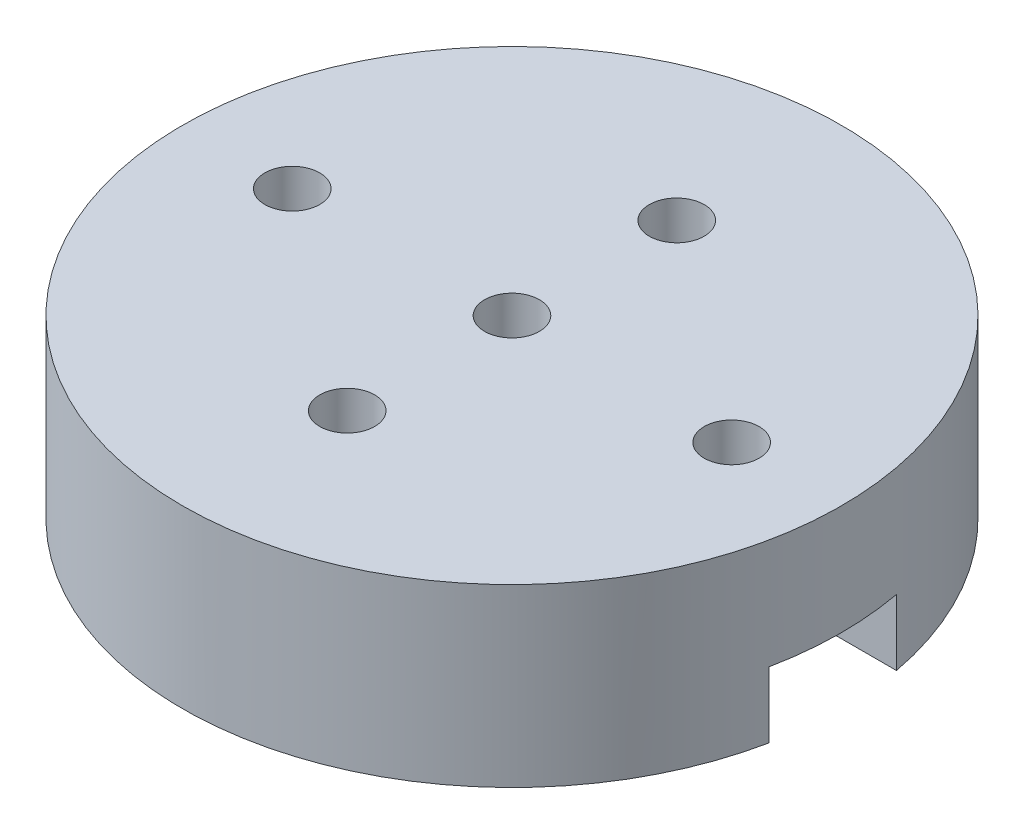
ISO-10303-21;
HEADER;
FILE_DESCRIPTION(('STEP AP214'),'2;1');
FILE_NAME('part.step','',(''),(''),'','','');
FILE_SCHEMA(('AUTOMOTIVE_DESIGN { 1 0 10303 214 1 1 1 1 }'));
ENDSEC;
DATA;
#1=APPLICATION_CONTEXT('core data for automotive mechanical design processes');
#2=APPLICATION_PROTOCOL_DEFINITION('international standard','automotive_design',2000,#1);
#3=PRODUCT_CONTEXT('',#1,'mechanical');
#4=PRODUCT('Part','Part','',(#3));
#5=PRODUCT_RELATED_PRODUCT_CATEGORY('part','',(#4));
#6=PRODUCT_DEFINITION_FORMATION('','',#4);
#7=PRODUCT_DEFINITION_CONTEXT('part definition',#1,'design');
#8=PRODUCT_DEFINITION('design','',#6,#7);
#9=PRODUCT_DEFINITION_SHAPE('','',#8);
#10=(LENGTH_UNIT() NAMED_UNIT(*) SI_UNIT(.MILLI.,.METRE.));
#11=(NAMED_UNIT(*) PLANE_ANGLE_UNIT() SI_UNIT($,.RADIAN.));
#12=(NAMED_UNIT(*) SI_UNIT($,.STERADIAN.) SOLID_ANGLE_UNIT());
#13=UNCERTAINTY_MEASURE_WITH_UNIT(LENGTH_MEASURE(1.E-05),#10,'distance_accuracy_value','');
#14=(GEOMETRIC_REPRESENTATION_CONTEXT(3) GLOBAL_UNCERTAINTY_ASSIGNED_CONTEXT((#13)) GLOBAL_UNIT_ASSIGNED_CONTEXT((#10,
#11,#12)) REPRESENTATION_CONTEXT('',''));
#15=CARTESIAN_POINT('',(0.,0.,0.));
#16=DIRECTION('',(0.,0.,1.));
#17=DIRECTION('',(1.,0.,0.));
#18=AXIS2_PLACEMENT_3D('',#15,#16,#17);
#19=CARTESIAN_POINT('',(0.,0.,0.));
#20=DIRECTION('',(0.,1.,0.));
#21=DIRECTION('',(0.,0.,1.));
#22=AXIS2_PLACEMENT_3D('',#19,#20,#21);
#23=PLANE('',#22);
#24=CARTESIAN_POINT('',(23.4547924708941,0.,-40.6248922405439));
#25=DIRECTION('',(0.,1.,0.));
#26=DIRECTION('',(0.,0.,1.));
#27=AXIS2_PLACEMENT_3D('',#24,#25,#26);
#28=CIRCLE('',#27,3.00000000000001);
#29=CARTESIAN_POINT('',(21.9547924708933,0.,-38.026816029191));
#30=VERTEX_POINT('',#29);
#31=CARTESIAN_POINT('',(24.9547924708948,0.,-43.2229684518967));
#32=VERTEX_POINT('',#31);
#33=EDGE_CURVE('E350',#30,#32,#28,.T.);
#34=ORIENTED_EDGE('',*,*,#33,.T.);
#35=CARTESIAN_POINT('',(0.,0.,2.91433543964104E-13));
#36=DIRECTION('',(0.,1.,0.));
#37=DIRECTION('',(0.,0.,1.));
#38=AXIS2_PLACEMENT_3D('',#35,#36,#37);
#39=CIRCLE('',#38,49.9095849417636);
#40=CARTESIAN_POINT('',(-24.9547924708814,0.,-43.2229684519044));
#41=VERTEX_POINT('',#40);
#42=EDGE_CURVE('E374',#32,#41,#39,.T.);
#43=ORIENTED_EDGE('',*,*,#42,.T.);
#44=CARTESIAN_POINT('',(-23.4547924708814,0.,-40.6248922405511));
#45=DIRECTION('',(0.,1.,0.));
#46=DIRECTION('',(0.,0.,1.));
#47=AXIS2_PLACEMENT_3D('',#44,#45,#46);
#48=CIRCLE('',#47,3.);
#49=CARTESIAN_POINT('',(-21.9547924708814,0.,-38.0268160291978));
#50=VERTEX_POINT('',#49);
#51=EDGE_CURVE('E378',#41,#50,#48,.T.);
#52=ORIENTED_EDGE('',*,*,#51,.T.);
#53=CARTESIAN_POINT('',(0.,0.,2.91433543964104E-13));
#54=DIRECTION('',(0.,1.,0.));
#55=DIRECTION('',(0.,0.,1.));
#56=AXIS2_PLACEMENT_3D('',#53,#54,#55);
#57=CIRCLE('',#56,43.9095849417636);
#58=EDGE_CURVE('E363',#30,#50,#57,.T.);
#59=ORIENTED_EDGE('',*,*,#58,.F.);
#60=EDGE_LOOP('',(#34,#43,#52,#59));
#61=FACE_BOUND('',#60,.T.);
#62=DIRECTION('',(0.,0.,1.));
#63=VECTOR('',#62,1.);
#64=CARTESIAN_POINT('',(-12.,0.,0.));
#65=LINE('',#64,#63);
#66=CARTESIAN_POINT('',(-12.,0.,-25.));
#67=VERTEX_POINT('',#66);
#68=CARTESIAN_POINT('',(-12.,0.,-11.0283902133288));
#69=VERTEX_POINT('',#68);
#70=EDGE_CURVE('E267',#67,#69,#65,.T.);
#71=ORIENTED_EDGE('',*,*,#70,.T.);
#72=DIRECTION('',(-1.,0.,0.));
#73=VECTOR('',#72,1.);
#74=CARTESIAN_POINT('',(0.,0.,-11.0283902133288));
#75=LINE('',#74,#73);
#76=CARTESIAN_POINT('',(-58.9777467296145,0.,-11.0283902133288));
#77=VERTEX_POINT('',#76);
#78=EDGE_CURVE('E274',#69,#77,#75,.T.);
#79=ORIENTED_EDGE('',*,*,#78,.T.);
#80=CARTESIAN_POINT('',(0.,0.,0.));
#81=DIRECTION('',(0.,1.,0.));
#82=DIRECTION('',(0.,0.,1.));
#83=AXIS2_PLACEMENT_3D('',#80,#81,#82);
#84=CIRCLE('',#83,60.);
#85=CARTESIAN_POINT('',(58.9777467296145,0.,-11.0283902133288));
#86=VERTEX_POINT('',#85);
#87=EDGE_CURVE('E60',#86,#77,#84,.T.);
#88=ORIENTED_EDGE('',*,*,#87,.F.);
#89=DIRECTION('',(-1.,0.,0.));
#90=VECTOR('',#89,1.);
#91=CARTESIAN_POINT('',(0.,0.,-11.0283902133288));
#92=LINE('',#91,#90);
#93=CARTESIAN_POINT('',(12.,0.,-11.0283902133288));
#94=VERTEX_POINT('',#93);
#95=EDGE_CURVE('E259',#86,#94,#92,.T.);
#96=ORIENTED_EDGE('',*,*,#95,.T.);
#97=DIRECTION('',(0.,0.,1.));
#98=VECTOR('',#97,1.);
#99=CARTESIAN_POINT('',(12.,0.,0.));
#100=LINE('',#99,#98);
#101=CARTESIAN_POINT('',(12.,0.,-25.));
#102=VERTEX_POINT('',#101);
#103=EDGE_CURVE('E265',#102,#94,#100,.T.);
#104=ORIENTED_EDGE('',*,*,#103,.F.);
#105=CARTESIAN_POINT('',(0.,0.,-25.));
#106=DIRECTION('',(0.,1.,0.));
#107=DIRECTION('',(0.,0.,1.));
#108=AXIS2_PLACEMENT_3D('',#105,#106,#107);
#109=CIRCLE('',#108,12.);
#110=EDGE_CURVE('E269',#102,#67,#109,.T.);
#111=ORIENTED_EDGE('',*,*,#110,.T.);
#112=EDGE_LOOP('',(#71,#79,#88,#96,#104,#111));
#113=FACE_BOUND('',#112,.T.);
#114=ADVANCED_FACE('F50',(#61,#113),#23,.F.);
#115=CARTESIAN_POINT('',(0.,0.,2.91433543964104E-13));
#116=DIRECTION('',(0.,-1.,0.));
#117=DIRECTION('',(0.,0.,-1.));
#118=AXIS2_PLACEMENT_3D('',#115,#116,#117);
#119=CIRCLE('',#118,49.9095849417631);
#120=CARTESIAN_POINT('',(24.9547924708948,0.,43.2229684518967));
#121=VERTEX_POINT('',#120);
#122=CARTESIAN_POINT('',(-24.9547924708814,0.,43.2229684519044));
#123=VERTEX_POINT('',#122);
#124=EDGE_CURVE('E335',#121,#123,#119,.T.);
#125=ORIENTED_EDGE('',*,*,#124,.F.);
#126=CARTESIAN_POINT('',(23.4547924708941,0.,40.6248922405439));
#127=DIRECTION('',(0.,-1.,0.));
#128=DIRECTION('',(0.,0.,-1.));
#129=AXIS2_PLACEMENT_3D('',#126,#127,#128);
#130=CIRCLE('',#129,3.00000000000001);
#131=CARTESIAN_POINT('',(21.9547924708933,0.,38.026816029191));
#132=VERTEX_POINT('',#131);
#133=EDGE_CURVE('E71',#132,#121,#130,.T.);
#134=ORIENTED_EDGE('',*,*,#133,.F.);
#135=CARTESIAN_POINT('',(0.,0.,2.91433543964104E-13));
#136=DIRECTION('',(0.,-1.,0.));
#137=DIRECTION('',(0.,0.,-1.));
#138=AXIS2_PLACEMENT_3D('',#135,#136,#137);
#139=CIRCLE('',#138,43.9095849417631);
#140=CARTESIAN_POINT('',(-21.9547924708814,0.,38.0268160291978));
#141=VERTEX_POINT('',#140);
#142=EDGE_CURVE('E316',#132,#141,#139,.T.);
#143=ORIENTED_EDGE('',*,*,#142,.T.);
#144=CARTESIAN_POINT('',(-23.4547924708814,0.,40.6248922405511));
#145=DIRECTION('',(0.,-1.,0.));
#146=DIRECTION('',(0.,0.,-1.));
#147=AXIS2_PLACEMENT_3D('',#144,#145,#146);
#148=CIRCLE('',#147,3.);
#149=EDGE_CURVE('E340',#123,#141,#148,.T.);
#150=ORIENTED_EDGE('',*,*,#149,.F.);
#151=EDGE_LOOP('',(#125,#134,#143,#150));
#152=FACE_BOUND('',#151,.T.);
#153=CARTESIAN_POINT('',(-58.7877538267963,0.,12.));
#154=VERTEX_POINT('',#153);
#155=CARTESIAN_POINT('',(58.7877538267949,0.,12.));
#156=VERTEX_POINT('',#155);
#157=EDGE_CURVE('E51',#154,#156,#84,.T.);
#158=ORIENTED_EDGE('',*,*,#157,.F.);
#159=DIRECTION('',(1.,0.,0.));
#160=VECTOR('',#159,1.);
#161=CARTESIAN_POINT('',(0.,0.,12.));
#162=LINE('',#161,#160);
#163=CARTESIAN_POINT('',(-12.0000000000002,0.,12.));
#164=VERTEX_POINT('',#163);
#165=EDGE_CURVE('E213',#154,#164,#162,.T.);
#166=ORIENTED_EDGE('',*,*,#165,.T.);
#167=DIRECTION('',(0.,0.,-1.));
#168=VECTOR('',#167,1.);
#169=CARTESIAN_POINT('',(-12.0000000000004,0.,2.09768100325818E-13));
#170=LINE('',#169,#168);
#171=CARTESIAN_POINT('',(-12.,0.,25.));
#172=VERTEX_POINT('',#171);
#173=EDGE_CURVE('E212',#172,#164,#170,.T.);
#174=ORIENTED_EDGE('',*,*,#173,.F.);
#175=CARTESIAN_POINT('',(0.,0.,25.));
#176=DIRECTION('',(0.,1.,0.));
#177=DIRECTION('',(0.,0.,1.));
#178=AXIS2_PLACEMENT_3D('',#175,#176,#177);
#179=CIRCLE('',#178,12.);
#180=CARTESIAN_POINT('',(12.,0.,25.));
#181=VERTEX_POINT('',#180);
#182=EDGE_CURVE('E61',#181,#172,#179,.F.);
#183=ORIENTED_EDGE('',*,*,#182,.F.);
#184=DIRECTION('',(0.,0.,-1.));
#185=VECTOR('',#184,1.);
#186=CARTESIAN_POINT('',(12.0000000000004,0.,2.09768100325818E-13));
#187=LINE('',#186,#185);
#188=CARTESIAN_POINT('',(12.0000000000002,0.,12.));
#189=VERTEX_POINT('',#188);
#190=EDGE_CURVE('E192',#181,#189,#187,.T.);
#191=ORIENTED_EDGE('',*,*,#190,.T.);
#192=DIRECTION('',(1.,0.,0.));
#193=VECTOR('',#192,1.);
#194=CARTESIAN_POINT('',(0.,0.,12.));
#195=LINE('',#194,#193);
#196=EDGE_CURVE('E251',#189,#156,#195,.T.);
#197=ORIENTED_EDGE('',*,*,#196,.T.);
#198=EDGE_LOOP('',(#158,#166,#174,#183,#191,#197));
#199=FACE_BOUND('',#198,.T.);
#200=ADVANCED_FACE('F424',(#152,#199),#23,.F.);
#201=CARTESIAN_POINT('',(0.,32.,0.));
#202=DIRECTION('',(0.,-1.,0.));
#203=DIRECTION('',(0.,0.,-1.));
#204=AXIS2_PLACEMENT_3D('',#201,#202,#203);
#205=CYLINDRICAL_SURFACE('',#204,60.);
#206=CARTESIAN_POINT('',(0.,12.,0.));
#207=DIRECTION('',(0.,1.,0.));
#208=DIRECTION('',(0.,0.,1.));
#209=AXIS2_PLACEMENT_3D('',#206,#207,#208);
#210=CIRCLE('',#209,60.);
#211=CARTESIAN_POINT('',(58.7877538267949,12.,12.));
#212=VERTEX_POINT('',#211);
#213=CARTESIAN_POINT('',(58.9777467296145,12.,-11.0283902133288));
#214=VERTEX_POINT('',#213);
#215=EDGE_CURVE('E225',#212,#214,#210,.T.);
#216=ORIENTED_EDGE('',*,*,#215,.T.);
#217=DIRECTION('',(0.,-1.,0.));
#218=VECTOR('',#217,1.);
#219=CARTESIAN_POINT('',(58.9777467296145,12.,-11.0283902133288));
#220=LINE('',#219,#218);
#221=EDGE_CURVE('E304',#214,#86,#220,.T.);
#222=ORIENTED_EDGE('',*,*,#221,.T.);
#223=ORIENTED_EDGE('',*,*,#87,.T.);
#224=DIRECTION('',(0.,-1.,0.));
#225=VECTOR('',#224,1.);
#226=CARTESIAN_POINT('',(-58.9777467296145,12.,-11.0283902133288));
#227=LINE('',#226,#225);
#228=CARTESIAN_POINT('',(-58.9777467296145,12.,-11.0283902133288));
#229=VERTEX_POINT('',#228);
#230=EDGE_CURVE('E287',#229,#77,#227,.T.);
#231=ORIENTED_EDGE('',*,*,#230,.F.);
#232=CARTESIAN_POINT('',(-58.7877538267963,12.,12.));
#233=VERTEX_POINT('',#232);
#234=EDGE_CURVE('E226',#229,#233,#210,.T.);
#235=ORIENTED_EDGE('',*,*,#234,.T.);
#236=DIRECTION('',(0.,-1.,0.));
#237=VECTOR('',#236,1.);
#238=CARTESIAN_POINT('',(-58.7877538267963,12.,12.));
#239=LINE('',#238,#237);
#240=EDGE_CURVE('E289',#233,#154,#239,.T.);
#241=ORIENTED_EDGE('',*,*,#240,.T.);
#242=ORIENTED_EDGE('',*,*,#157,.T.);
#243=DIRECTION('',(0.,-1.,0.));
#244=VECTOR('',#243,1.);
#245=CARTESIAN_POINT('',(58.7877538267949,12.,12.));
#246=LINE('',#245,#244);
#247=EDGE_CURVE('E307',#212,#156,#246,.T.);
#248=ORIENTED_EDGE('',*,*,#247,.F.);
#249=EDGE_LOOP('',(#216,#222,#223,#231,#235,#241,#242,#248));
#250=FACE_BOUND('',#249,.T.);
#251=CARTESIAN_POINT('',(0.,32.,0.));
#252=DIRECTION('',(0.,1.,0.));
#253=DIRECTION('',(0.,0.,1.));
#254=AXIS2_PLACEMENT_3D('',#251,#252,#253);
#255=CIRCLE('',#254,60.);
#256=CARTESIAN_POINT('',(0.,32.,60.));
#257=VERTEX_POINT('',#256);
#258=EDGE_CURVE('E11',#257,#257,#255,.T.);
#259=ORIENTED_EDGE('',*,*,#258,.F.);
#260=EDGE_LOOP('',(#259));
#261=FACE_BOUND('',#260,.T.);
#262=ADVANCED_FACE('F47',(#250,#261),#205,.T.);
#263=CARTESIAN_POINT('',(0.,32.,0.));
#264=DIRECTION('',(0.,1.,0.));
#265=DIRECTION('',(0.,0.,1.));
#266=AXIS2_PLACEMENT_3D('',#263,#264,#265);
#267=PLANE('',#266);
#268=CARTESIAN_POINT('',(0.,32.,-30.));
#269=DIRECTION('',(0.,1.,0.));
#270=DIRECTION('',(0.,0.,1.));
#271=AXIS2_PLACEMENT_3D('',#268,#269,#270);
#272=CIRCLE('',#271,5.);
#273=CARTESIAN_POINT('',(0.,32.,-25.));
#274=VERTEX_POINT('',#273);
#275=EDGE_CURVE('E721',#274,#274,#272,.F.);
#276=ORIENTED_EDGE('',*,*,#275,.T.);
#277=EDGE_LOOP('',(#276));
#278=FACE_BOUND('',#277,.T.);
#279=CARTESIAN_POINT('',(40.,32.,0.));
#280=DIRECTION('',(0.,1.,0.));
#281=DIRECTION('',(0.,0.,1.));
#282=AXIS2_PLACEMENT_3D('',#279,#280,#281);
#283=CIRCLE('',#282,5.);
#284=CARTESIAN_POINT('',(40.,32.,5.));
#285=VERTEX_POINT('',#284);
#286=EDGE_CURVE('E733',#285,#285,#283,.F.);
#287=ORIENTED_EDGE('',*,*,#286,.T.);
#288=EDGE_LOOP('',(#287));
#289=FACE_BOUND('',#288,.T.);
#290=CARTESIAN_POINT('',(0.,32.,0.));
#291=DIRECTION('',(0.,1.,0.));
#292=DIRECTION('',(0.,0.,1.));
#293=AXIS2_PLACEMENT_3D('',#290,#291,#292);
#294=CIRCLE('',#293,5.);
#295=CARTESIAN_POINT('',(0.,32.,5.));
#296=VERTEX_POINT('',#295);
#297=EDGE_CURVE('E745',#296,#296,#294,.F.);
#298=ORIENTED_EDGE('',*,*,#297,.T.);
#299=EDGE_LOOP('',(#298));
#300=FACE_BOUND('',#299,.T.);
#301=CARTESIAN_POINT('',(-40.,32.,0.));
#302=DIRECTION('',(0.,1.,0.));
#303=DIRECTION('',(0.,0.,1.));
#304=AXIS2_PLACEMENT_3D('',#301,#302,#303);
#305=CIRCLE('',#304,5.);
#306=CARTESIAN_POINT('',(-40.,32.,5.));
#307=VERTEX_POINT('',#306);
#308=EDGE_CURVE('E753',#307,#307,#305,.F.);
#309=ORIENTED_EDGE('',*,*,#308,.T.);
#310=EDGE_LOOP('',(#309));
#311=FACE_BOUND('',#310,.T.);
#312=CARTESIAN_POINT('',(0.,32.,30.));
#313=DIRECTION('',(0.,1.,0.));
#314=DIRECTION('',(0.,0.,1.));
#315=AXIS2_PLACEMENT_3D('',#312,#313,#314);
#316=CIRCLE('',#315,5.);
#317=CARTESIAN_POINT('',(0.,32.,35.));
#318=VERTEX_POINT('',#317);
#319=EDGE_CURVE('E219',#318,#318,#316,.F.);
#320=ORIENTED_EDGE('',*,*,#319,.T.);
#321=EDGE_LOOP('',(#320));
#322=FACE_BOUND('',#321,.T.);
#323=ORIENTED_EDGE('',*,*,#258,.T.);
#324=EDGE_LOOP('',(#323));
#325=FACE_BOUND('',#324,.T.);
#326=ADVANCED_FACE('F464',(#278,#289,#300,#311,#322,#325),#267,.T.);
#327=CARTESIAN_POINT('',(23.4547924708941,12.,-40.6248922405439));
#328=DIRECTION('',(0.,-1.,0.));
#329=DIRECTION('',(0.,0.,-1.));
#330=AXIS2_PLACEMENT_3D('',#327,#328,#329);
#331=CYLINDRICAL_SURFACE('',#330,3.00000000000001);
#332=ORIENTED_EDGE('',*,*,#33,.F.);
#333=DIRECTION('',(0.,-1.,0.));
#334=VECTOR('',#333,1.);
#335=CARTESIAN_POINT('',(21.9547924708933,12.,-38.026816029191));
#336=LINE('',#335,#334);
#337=CARTESIAN_POINT('',(21.9547924708933,12.,-38.026816029191));
#338=VERTEX_POINT('',#337);
#339=EDGE_CURVE('E371',#338,#30,#336,.T.);
#340=ORIENTED_EDGE('',*,*,#339,.F.);
#341=CARTESIAN_POINT('',(23.4547924708941,12.,-40.6248922405439));
#342=DIRECTION('',(0.,1.,0.));
#343=DIRECTION('',(0.,0.,1.));
#344=AXIS2_PLACEMENT_3D('',#341,#342,#343);
#345=CIRCLE('',#344,3.00000000000001);
#346=CARTESIAN_POINT('',(24.9547924708948,12.,-43.2229684518967));
#347=VERTEX_POINT('',#346);
#348=EDGE_CURVE('E358',#338,#347,#345,.T.);
#349=ORIENTED_EDGE('',*,*,#348,.T.);
#350=DIRECTION('',(0.,-1.,0.));
#351=VECTOR('',#350,1.);
#352=CARTESIAN_POINT('',(24.9547924708948,12.,-43.2229684518967));
#353=LINE('',#352,#351);
#354=EDGE_CURVE('E393',#347,#32,#353,.T.);
#355=ORIENTED_EDGE('',*,*,#354,.T.);
#356=EDGE_LOOP('',(#332,#340,#349,#355));
#357=FACE_BOUND('',#356,.T.);
#358=ADVANCED_FACE('F463',(#357),#331,.F.);
#359=CARTESIAN_POINT('',(0.,12.,2.91433543964104E-13));
#360=DIRECTION('',(0.,-1.,0.));
#361=DIRECTION('',(0.,0.,-1.));
#362=AXIS2_PLACEMENT_3D('',#359,#360,#361);
#363=CYLINDRICAL_SURFACE('',#362,49.9095849417636);
#364=ORIENTED_EDGE('',*,*,#42,.F.);
#365=ORIENTED_EDGE('',*,*,#354,.F.);
#366=CARTESIAN_POINT('',(0.,12.,2.91433543964104E-13));
#367=DIRECTION('',(0.,1.,0.));
#368=DIRECTION('',(0.,0.,1.));
#369=AXIS2_PLACEMENT_3D('',#366,#367,#368);
#370=CIRCLE('',#369,49.9095849417636);
#371=CARTESIAN_POINT('',(-24.9547924708814,12.,-43.2229684519044));
#372=VERTEX_POINT('',#371);
#373=EDGE_CURVE('E359',#347,#372,#370,.T.);
#374=ORIENTED_EDGE('',*,*,#373,.T.);
#375=DIRECTION('',(0.,-1.,0.));
#376=VECTOR('',#375,1.);
#377=CARTESIAN_POINT('',(-24.9547924708814,12.,-43.2229684519044));
#378=LINE('',#377,#376);
#379=EDGE_CURVE('E395',#372,#41,#378,.T.);
#380=ORIENTED_EDGE('',*,*,#379,.T.);
#381=EDGE_LOOP('',(#364,#365,#374,#380));
#382=FACE_BOUND('',#381,.T.);
#383=ADVANCED_FACE('F466',(#382),#363,.F.);
#384=CARTESIAN_POINT('',(-23.4547924708814,12.,-40.6248922405511));
#385=DIRECTION('',(0.,-1.,0.));
#386=DIRECTION('',(0.,0.,-1.));
#387=AXIS2_PLACEMENT_3D('',#384,#385,#386);
#388=CYLINDRICAL_SURFACE('',#387,3.);
#389=ORIENTED_EDGE('',*,*,#51,.F.);
#390=ORIENTED_EDGE('',*,*,#379,.F.);
#391=CARTESIAN_POINT('',(-23.4547924708814,12.,-40.6248922405511));
#392=DIRECTION('',(0.,1.,0.));
#393=DIRECTION('',(0.,0.,1.));
#394=AXIS2_PLACEMENT_3D('',#391,#392,#393);
#395=CIRCLE('',#394,3.);
#396=CARTESIAN_POINT('',(-21.9547924708814,12.,-38.0268160291978));
#397=VERTEX_POINT('',#396);
#398=EDGE_CURVE('E364',#372,#397,#395,.T.);
#399=ORIENTED_EDGE('',*,*,#398,.T.);
#400=DIRECTION('',(0.,-1.,0.));
#401=VECTOR('',#400,1.);
#402=CARTESIAN_POINT('',(-21.9547924708814,12.,-38.0268160291978));
#403=LINE('',#402,#401);
#404=EDGE_CURVE('E386',#397,#50,#403,.T.);
#405=ORIENTED_EDGE('',*,*,#404,.T.);
#406=EDGE_LOOP('',(#389,#390,#399,#405));
#407=FACE_BOUND('',#406,.T.);
#408=ADVANCED_FACE('F472',(#407),#388,.F.);
#409=CARTESIAN_POINT('',(0.,12.,2.91433543964104E-13));
#410=DIRECTION('',(0.,-1.,0.));
#411=DIRECTION('',(0.,0.,-1.));
#412=AXIS2_PLACEMENT_3D('',#409,#410,#411);
#413=CYLINDRICAL_SURFACE('',#412,43.9095849417636);
#414=ORIENTED_EDGE('',*,*,#58,.T.);
#415=ORIENTED_EDGE('',*,*,#404,.F.);
#416=CARTESIAN_POINT('',(0.,12.,2.91433543964104E-13));
#417=DIRECTION('',(0.,1.,0.));
#418=DIRECTION('',(0.,0.,1.));
#419=AXIS2_PLACEMENT_3D('',#416,#417,#418);
#420=CIRCLE('',#419,43.9095849417636);
#421=EDGE_CURVE('E370',#338,#397,#420,.T.);
#422=ORIENTED_EDGE('',*,*,#421,.F.);
#423=ORIENTED_EDGE('',*,*,#339,.T.);
#424=EDGE_LOOP('',(#414,#415,#422,#423));
#425=FACE_BOUND('',#424,.T.);
#426=ADVANCED_FACE('F473',(#425),#413,.T.);
#427=CARTESIAN_POINT('',(11.727396235447,12.,-20.3124461202718));
#428=DIRECTION('',(0.,1.,0.));
#429=DIRECTION('',(0.,0.,1.));
#430=AXIS2_PLACEMENT_3D('',#427,#428,#429);
#431=PLANE('',#430);
#432=ORIENTED_EDGE('',*,*,#348,.F.);
#433=ORIENTED_EDGE('',*,*,#421,.T.);
#434=ORIENTED_EDGE('',*,*,#398,.F.);
#435=ORIENTED_EDGE('',*,*,#373,.F.);
#436=EDGE_LOOP('',(#432,#433,#434,#435));
#437=FACE_BOUND('',#436,.T.);
#438=ADVANCED_FACE('F476',(#437),#431,.F.);
#439=CARTESIAN_POINT('',(23.4547924708941,12.,40.6248922405439));
#440=DIRECTION('',(0.,-1.,0.));
#441=DIRECTION('',(0.,0.,-1.));
#442=AXIS2_PLACEMENT_3D('',#439,#440,#441);
#443=CYLINDRICAL_SURFACE('',#442,3.00000000000001);
#444=ORIENTED_EDGE('',*,*,#133,.T.);
#445=DIRECTION('',(0.,-1.,0.));
#446=VECTOR('',#445,1.);
#447=CARTESIAN_POINT('',(24.9547924708948,12.,43.2229684518967));
#448=LINE('',#447,#446);
#449=CARTESIAN_POINT('',(24.9547924708948,12.,43.2229684518967));
#450=VERTEX_POINT('',#449);
#451=EDGE_CURVE('E328',#450,#121,#448,.T.);
#452=ORIENTED_EDGE('',*,*,#451,.F.);
#453=CARTESIAN_POINT('',(23.4547924708941,12.,40.6248922405439));
#454=DIRECTION('',(0.,-1.,0.));
#455=DIRECTION('',(0.,0.,-1.));
#456=AXIS2_PLACEMENT_3D('',#453,#454,#455);
#457=CIRCLE('',#456,3.00000000000001);
#458=CARTESIAN_POINT('',(21.9547924708933,12.,38.026816029191));
#459=VERTEX_POINT('',#458);
#460=EDGE_CURVE('E313',#459,#450,#457,.T.);
#461=ORIENTED_EDGE('',*,*,#460,.F.);
#462=DIRECTION('',(0.,-1.,0.));
#463=VECTOR('',#462,1.);
#464=CARTESIAN_POINT('',(21.9547924708933,12.,38.026816029191));
#465=LINE('',#464,#463);
#466=EDGE_CURVE('E341',#459,#132,#465,.T.);
#467=ORIENTED_EDGE('',*,*,#466,.T.);
#468=EDGE_LOOP('',(#444,#452,#461,#467));
#469=FACE_BOUND('',#468,.T.);
#470=ADVANCED_FACE('F485',(#469),#443,.F.);
#471=CARTESIAN_POINT('',(0.,12.,2.91433543964104E-13));
#472=DIRECTION('',(0.,-1.,0.));
#473=DIRECTION('',(0.,0.,-1.));
#474=AXIS2_PLACEMENT_3D('',#471,#472,#473);
#475=CYLINDRICAL_SURFACE('',#474,43.9095849417631);
#476=ORIENTED_EDGE('',*,*,#142,.F.);
#477=ORIENTED_EDGE('',*,*,#466,.F.);
#478=CARTESIAN_POINT('',(0.,12.,2.91433543964104E-13));
#479=DIRECTION('',(0.,-1.,0.));
#480=DIRECTION('',(0.,0.,-1.));
#481=AXIS2_PLACEMENT_3D('',#478,#479,#480);
#482=CIRCLE('',#481,43.9095849417631);
#483=CARTESIAN_POINT('',(-21.9547924708814,12.,38.0268160291978));
#484=VERTEX_POINT('',#483);
#485=EDGE_CURVE('E330',#459,#484,#482,.T.);
#486=ORIENTED_EDGE('',*,*,#485,.T.);
#487=DIRECTION('',(0.,-1.,0.));
#488=VECTOR('',#487,1.);
#489=CARTESIAN_POINT('',(-21.9547924708814,12.,38.0268160291978));
#490=LINE('',#489,#488);
#491=EDGE_CURVE('E349',#484,#141,#490,.T.);
#492=ORIENTED_EDGE('',*,*,#491,.T.);
#493=EDGE_LOOP('',(#476,#477,#486,#492));
#494=FACE_BOUND('',#493,.T.);
#495=ADVANCED_FACE('F487',(#494),#475,.T.);
#496=CARTESIAN_POINT('',(-23.4547924708814,12.,40.6248922405511));
#497=DIRECTION('',(0.,-1.,0.));
#498=DIRECTION('',(0.,0.,-1.));
#499=AXIS2_PLACEMENT_3D('',#496,#497,#498);
#500=CYLINDRICAL_SURFACE('',#499,3.);
#501=ORIENTED_EDGE('',*,*,#149,.T.);
#502=ORIENTED_EDGE('',*,*,#491,.F.);
#503=CARTESIAN_POINT('',(-23.4547924708814,12.,40.6248922405511));
#504=DIRECTION('',(0.,-1.,0.));
#505=DIRECTION('',(0.,0.,-1.));
#506=AXIS2_PLACEMENT_3D('',#503,#504,#505);
#507=CIRCLE('',#506,3.);
#508=CARTESIAN_POINT('',(-24.9547924708814,12.,43.2229684519044));
#509=VERTEX_POINT('',#508);
#510=EDGE_CURVE('E324',#509,#484,#507,.T.);
#511=ORIENTED_EDGE('',*,*,#510,.F.);
#512=DIRECTION('',(0.,-1.,0.));
#513=VECTOR('',#512,1.);
#514=CARTESIAN_POINT('',(-24.9547924708814,12.,43.2229684519044));
#515=LINE('',#514,#513);
#516=EDGE_CURVE('E354',#509,#123,#515,.T.);
#517=ORIENTED_EDGE('',*,*,#516,.T.);
#518=EDGE_LOOP('',(#501,#502,#511,#517));
#519=FACE_BOUND('',#518,.T.);
#520=ADVANCED_FACE('F495',(#519),#500,.F.);
#521=CARTESIAN_POINT('',(0.,12.,2.91433543964104E-13));
#522=DIRECTION('',(0.,-1.,0.));
#523=DIRECTION('',(0.,0.,-1.));
#524=AXIS2_PLACEMENT_3D('',#521,#522,#523);
#525=CYLINDRICAL_SURFACE('',#524,49.9095849417631);
#526=ORIENTED_EDGE('',*,*,#124,.T.);
#527=ORIENTED_EDGE('',*,*,#516,.F.);
#528=CARTESIAN_POINT('',(0.,12.,2.91433543964104E-13));
#529=DIRECTION('',(0.,-1.,0.));
#530=DIRECTION('',(0.,0.,-1.));
#531=AXIS2_PLACEMENT_3D('',#528,#529,#530);
#532=CIRCLE('',#531,49.9095849417631);
#533=EDGE_CURVE('E319',#450,#509,#532,.T.);
#534=ORIENTED_EDGE('',*,*,#533,.F.);
#535=ORIENTED_EDGE('',*,*,#451,.T.);
#536=EDGE_LOOP('',(#526,#527,#534,#535));
#537=FACE_BOUND('',#536,.T.);
#538=ADVANCED_FACE('F486',(#537),#525,.F.);
#539=CARTESIAN_POINT('',(11.727396235447,12.,20.3124461202721));
#540=DIRECTION('',(0.,-1.,0.));
#541=DIRECTION('',(0.,0.,-1.));
#542=AXIS2_PLACEMENT_3D('',#539,#540,#541);
#543=PLANE('',#542);
#544=ORIENTED_EDGE('',*,*,#460,.T.);
#545=ORIENTED_EDGE('',*,*,#533,.T.);
#546=ORIENTED_EDGE('',*,*,#510,.T.);
#547=ORIENTED_EDGE('',*,*,#485,.F.);
#548=EDGE_LOOP('',(#544,#545,#546,#547));
#549=FACE_BOUND('',#548,.T.);
#550=ADVANCED_FACE('F493',(#549),#543,.T.);
#551=CARTESIAN_POINT('',(0.,12.,25.));
#552=DIRECTION('',(0.,-1.,0.));
#553=DIRECTION('',(0.,0.,-1.));
#554=AXIS2_PLACEMENT_3D('',#551,#552,#553);
#555=CYLINDRICAL_SURFACE('',#554,12.);
#556=ORIENTED_EDGE('',*,*,#182,.T.);
#557=DIRECTION('',(0.,-1.,0.));
#558=VECTOR('',#557,1.);
#559=CARTESIAN_POINT('',(-12.,12.,25.));
#560=LINE('',#559,#558);
#561=CARTESIAN_POINT('',(-12.,12.,25.));
#562=VERTEX_POINT('',#561);
#563=EDGE_CURVE('E209',#562,#172,#560,.T.);
#564=ORIENTED_EDGE('',*,*,#563,.F.);
#565=CARTESIAN_POINT('',(0.,12.,25.));
#566=DIRECTION('',(0.,1.,0.));
#567=DIRECTION('',(0.,0.,1.));
#568=AXIS2_PLACEMENT_3D('',#565,#566,#567);
#569=CIRCLE('',#568,12.);
#570=CARTESIAN_POINT('',(12.,12.,25.));
#571=VERTEX_POINT('',#570);
#572=EDGE_CURVE('E201',#571,#562,#569,.F.);
#573=ORIENTED_EDGE('',*,*,#572,.F.);
#574=DIRECTION('',(0.,-1.,0.));
#575=VECTOR('',#574,1.);
#576=CARTESIAN_POINT('',(12.,12.,25.));
#577=LINE('',#576,#575);
#578=EDGE_CURVE('E184',#571,#181,#577,.T.);
#579=ORIENTED_EDGE('',*,*,#578,.T.);
#580=EDGE_LOOP('',(#556,#564,#573,#579));
#581=FACE_BOUND('',#580,.T.);
#582=ADVANCED_FACE('F206',(#581),#555,.F.);
#583=CARTESIAN_POINT('',(12.0000000000004,12.,2.09768100325818E-13));
#584=DIRECTION('',(-1.,0.,0.));
#585=DIRECTION('',(0.,0.,1.));
#586=AXIS2_PLACEMENT_3D('',#583,#584,#585);
#587=PLANE('',#586);
#588=ORIENTED_EDGE('',*,*,#190,.F.);
#589=ORIENTED_EDGE('',*,*,#578,.F.);
#590=DIRECTION('',(0.,0.,-1.));
#591=VECTOR('',#590,1.);
#592=CARTESIAN_POINT('',(12.0000000000004,12.,2.09768100325818E-13));
#593=LINE('',#592,#591);
#594=CARTESIAN_POINT('',(12.0000000000002,12.,12.));
#595=VERTEX_POINT('',#594);
#596=EDGE_CURVE('E189',#571,#595,#593,.T.);
#597=ORIENTED_EDGE('',*,*,#596,.T.);
#598=DIRECTION('',(0.,-1.,0.));
#599=VECTOR('',#598,1.);
#600=CARTESIAN_POINT('',(12.0000000000002,12.,12.));
#601=LINE('',#600,#599);
#602=EDGE_CURVE('E191',#595,#189,#601,.T.);
#603=ORIENTED_EDGE('',*,*,#602,.T.);
#604=EDGE_LOOP('',(#588,#589,#597,#603));
#605=FACE_BOUND('',#604,.T.);
#606=ADVANCED_FACE('F190',(#605),#587,.T.);
#607=CARTESIAN_POINT('',(0.,12.,12.));
#608=DIRECTION('',(0.,0.,-1.));
#609=DIRECTION('',(-1.,0.,0.));
#610=AXIS2_PLACEMENT_3D('',#607,#608,#609);
#611=PLANE('',#610);
#612=ORIENTED_EDGE('',*,*,#196,.F.);
#613=ORIENTED_EDGE('',*,*,#602,.F.);
#614=DIRECTION('',(1.,0.,0.));
#615=VECTOR('',#614,1.);
#616=CARTESIAN_POINT('',(0.,12.,12.));
#617=LINE('',#616,#615);
#618=EDGE_CURVE('E202',#595,#212,#617,.T.);
#619=ORIENTED_EDGE('',*,*,#618,.T.);
#620=ORIENTED_EDGE('',*,*,#247,.T.);
#621=EDGE_LOOP('',(#612,#613,#619,#620));
#622=FACE_BOUND('',#621,.T.);
#623=ADVANCED_FACE('F429',(#622),#611,.T.);
#624=CARTESIAN_POINT('',(0.,12.,-11.0283902133288));
#625=DIRECTION('',(0.,0.,1.));
#626=DIRECTION('',(1.,0.,0.));
#627=AXIS2_PLACEMENT_3D('',#624,#625,#626);
#628=PLANE('',#627);
#629=ORIENTED_EDGE('',*,*,#95,.F.);
#630=ORIENTED_EDGE('',*,*,#221,.F.);
#631=DIRECTION('',(-1.,0.,0.));
#632=VECTOR('',#631,1.);
#633=CARTESIAN_POINT('',(0.,12.,-11.0283902133288));
#634=LINE('',#633,#632);
#635=CARTESIAN_POINT('',(12.,12.,-11.0283902133288));
#636=VERTEX_POINT('',#635);
#637=EDGE_CURVE('E227',#214,#636,#634,.T.);
#638=ORIENTED_EDGE('',*,*,#637,.T.);
#639=DIRECTION('',(0.,-1.,0.));
#640=VECTOR('',#639,1.);
#641=CARTESIAN_POINT('',(12.,12.,-11.0283902133288));
#642=LINE('',#641,#640);
#643=EDGE_CURVE('E305',#636,#94,#642,.T.);
#644=ORIENTED_EDGE('',*,*,#643,.T.);
#645=EDGE_LOOP('',(#629,#630,#638,#644));
#646=FACE_BOUND('',#645,.T.);
#647=ADVANCED_FACE('F434',(#646),#628,.T.);
#648=CARTESIAN_POINT('',(12.,12.,0.));
#649=DIRECTION('',(1.,0.,0.));
#650=DIRECTION('',(0.,0.,-1.));
#651=AXIS2_PLACEMENT_3D('',#648,#649,#650);
#652=PLANE('',#651);
#653=ORIENTED_EDGE('',*,*,#103,.T.);
#654=ORIENTED_EDGE('',*,*,#643,.F.);
#655=DIRECTION('',(0.,0.,1.));
#656=VECTOR('',#655,1.);
#657=CARTESIAN_POINT('',(12.,12.,0.));
#658=LINE('',#657,#656);
#659=CARTESIAN_POINT('',(12.,12.,-25.));
#660=VERTEX_POINT('',#659);
#661=EDGE_CURVE('E233',#660,#636,#658,.T.);
#662=ORIENTED_EDGE('',*,*,#661,.F.);
#663=DIRECTION('',(0.,-1.,0.));
#664=VECTOR('',#663,1.);
#665=CARTESIAN_POINT('',(12.,12.,-25.));
#666=LINE('',#665,#664);
#667=EDGE_CURVE('E299',#660,#102,#666,.T.);
#668=ORIENTED_EDGE('',*,*,#667,.T.);
#669=EDGE_LOOP('',(#653,#654,#662,#668));
#670=FACE_BOUND('',#669,.T.);
#671=ADVANCED_FACE('F440',(#670),#652,.F.);
#672=CARTESIAN_POINT('',(0.,12.,-25.));
#673=DIRECTION('',(0.,-1.,0.));
#674=DIRECTION('',(0.,0.,-1.));
#675=AXIS2_PLACEMENT_3D('',#672,#673,#674);
#676=CYLINDRICAL_SURFACE('',#675,12.);
#677=ORIENTED_EDGE('',*,*,#110,.F.);
#678=ORIENTED_EDGE('',*,*,#667,.F.);
#679=CARTESIAN_POINT('',(0.,12.,-25.));
#680=DIRECTION('',(0.,1.,0.));
#681=DIRECTION('',(0.,0.,1.));
#682=AXIS2_PLACEMENT_3D('',#679,#680,#681);
#683=CIRCLE('',#682,12.);
#684=CARTESIAN_POINT('',(-12.,12.,-25.));
#685=VERTEX_POINT('',#684);
#686=EDGE_CURVE('E232',#660,#685,#683,.T.);
#687=ORIENTED_EDGE('',*,*,#686,.T.);
#688=DIRECTION('',(0.,-1.,0.));
#689=VECTOR('',#688,1.);
#690=CARTESIAN_POINT('',(-12.,12.,-25.));
#691=LINE('',#690,#689);
#692=EDGE_CURVE('E298',#685,#67,#691,.T.);
#693=ORIENTED_EDGE('',*,*,#692,.T.);
#694=EDGE_LOOP('',(#677,#678,#687,#693));
#695=FACE_BOUND('',#694,.T.);
#696=ADVANCED_FACE('F439',(#695),#676,.F.);
#697=CARTESIAN_POINT('',(-12.,12.,0.));
#698=DIRECTION('',(1.,0.,0.));
#699=DIRECTION('',(0.,0.,-1.));
#700=AXIS2_PLACEMENT_3D('',#697,#698,#699);
#701=PLANE('',#700);
#702=ORIENTED_EDGE('',*,*,#70,.F.);
#703=ORIENTED_EDGE('',*,*,#692,.F.);
#704=DIRECTION('',(0.,0.,1.));
#705=VECTOR('',#704,1.);
#706=CARTESIAN_POINT('',(-12.,12.,0.));
#707=LINE('',#706,#705);
#708=CARTESIAN_POINT('',(-12.,12.,-11.0283902133288));
#709=VERTEX_POINT('',#708);
#710=EDGE_CURVE('E238',#685,#709,#707,.T.);
#711=ORIENTED_EDGE('',*,*,#710,.T.);
#712=DIRECTION('',(0.,-1.,0.));
#713=VECTOR('',#712,1.);
#714=CARTESIAN_POINT('',(-12.,12.,-11.0283902133288));
#715=LINE('',#714,#713);
#716=EDGE_CURVE('E291',#709,#69,#715,.T.);
#717=ORIENTED_EDGE('',*,*,#716,.T.);
#718=EDGE_LOOP('',(#702,#703,#711,#717));
#719=FACE_BOUND('',#718,.T.);
#720=ADVANCED_FACE('F442',(#719),#701,.T.);
#721=CARTESIAN_POINT('',(0.,12.,-11.0283902133288));
#722=DIRECTION('',(0.,0.,1.));
#723=DIRECTION('',(1.,0.,0.));
#724=AXIS2_PLACEMENT_3D('',#721,#722,#723);
#725=PLANE('',#724);
#726=ORIENTED_EDGE('',*,*,#78,.F.);
#727=ORIENTED_EDGE('',*,*,#716,.F.);
#728=DIRECTION('',(-1.,0.,0.));
#729=VECTOR('',#728,1.);
#730=CARTESIAN_POINT('',(0.,12.,-11.0283902133288));
#731=LINE('',#730,#729);
#732=EDGE_CURVE('E241',#709,#229,#731,.T.);
#733=ORIENTED_EDGE('',*,*,#732,.T.);
#734=ORIENTED_EDGE('',*,*,#230,.T.);
#735=EDGE_LOOP('',(#726,#727,#733,#734));
#736=FACE_BOUND('',#735,.T.);
#737=ADVANCED_FACE('F416',(#736),#725,.T.);
#738=CARTESIAN_POINT('',(0.,12.,12.));
#739=DIRECTION('',(0.,0.,-1.));
#740=DIRECTION('',(-1.,0.,0.));
#741=AXIS2_PLACEMENT_3D('',#738,#739,#740);
#742=PLANE('',#741);
#743=ORIENTED_EDGE('',*,*,#165,.F.);
#744=ORIENTED_EDGE('',*,*,#240,.F.);
#745=DIRECTION('',(1.,0.,0.));
#746=VECTOR('',#745,1.);
#747=CARTESIAN_POINT('',(0.,12.,12.));
#748=LINE('',#747,#746);
#749=CARTESIAN_POINT('',(-12.0000000000002,12.,12.));
#750=VERTEX_POINT('',#749);
#751=EDGE_CURVE('E242',#233,#750,#748,.T.);
#752=ORIENTED_EDGE('',*,*,#751,.T.);
#753=DIRECTION('',(0.,-1.,0.));
#754=VECTOR('',#753,1.);
#755=CARTESIAN_POINT('',(-12.0000000000002,12.,12.));
#756=LINE('',#755,#754);
#757=EDGE_CURVE('E284',#750,#164,#756,.T.);
#758=ORIENTED_EDGE('',*,*,#757,.T.);
#759=EDGE_LOOP('',(#743,#744,#752,#758));
#760=FACE_BOUND('',#759,.T.);
#761=ADVANCED_FACE('F448',(#760),#742,.T.);
#762=CARTESIAN_POINT('',(-12.0000000000004,12.,2.09768100325818E-13));
#763=DIRECTION('',(-1.,0.,0.));
#764=DIRECTION('',(0.,0.,1.));
#765=AXIS2_PLACEMENT_3D('',#762,#763,#764);
#766=PLANE('',#765);
#767=ORIENTED_EDGE('',*,*,#173,.T.);
#768=ORIENTED_EDGE('',*,*,#757,.F.);
#769=DIRECTION('',(0.,0.,-1.));
#770=VECTOR('',#769,1.);
#771=CARTESIAN_POINT('',(-12.0000000000004,12.,2.09768100325818E-13));
#772=LINE('',#771,#770);
#773=EDGE_CURVE('E250',#562,#750,#772,.T.);
#774=ORIENTED_EDGE('',*,*,#773,.F.);
#775=ORIENTED_EDGE('',*,*,#563,.T.);
#776=EDGE_LOOP('',(#767,#768,#774,#775));
#777=FACE_BOUND('',#776,.T.);
#778=ADVANCED_FACE('F544',(#777),#766,.F.);
#779=CARTESIAN_POINT('',(0.,12.,0.));
#780=DIRECTION('',(0.,1.,0.));
#781=DIRECTION('',(0.,0.,1.));
#782=AXIS2_PLACEMENT_3D('',#779,#780,#781);
#783=PLANE('',#782);
#784=ORIENTED_EDGE('',*,*,#572,.T.);
#785=ORIENTED_EDGE('',*,*,#773,.T.);
#786=ORIENTED_EDGE('',*,*,#751,.F.);
#787=ORIENTED_EDGE('',*,*,#234,.F.);
#788=ORIENTED_EDGE('',*,*,#732,.F.);
#789=ORIENTED_EDGE('',*,*,#710,.F.);
#790=ORIENTED_EDGE('',*,*,#686,.F.);
#791=ORIENTED_EDGE('',*,*,#661,.T.);
#792=ORIENTED_EDGE('',*,*,#637,.F.);
#793=ORIENTED_EDGE('',*,*,#215,.F.);
#794=ORIENTED_EDGE('',*,*,#618,.F.);
#795=ORIENTED_EDGE('',*,*,#596,.F.);
#796=EDGE_LOOP('',(#784,#785,#786,#787,#788,#789,#790,#791,#792,#793,#794,#795));
#797=FACE_BOUND('',#796,.T.);
#798=CARTESIAN_POINT('',(0.,12.,-30.));
#799=DIRECTION('',(0.,1.,0.));
#800=DIRECTION('',(0.,0.,1.));
#801=AXIS2_PLACEMENT_3D('',#798,#799,#800);
#802=CIRCLE('',#801,5.);
#803=CARTESIAN_POINT('',(0.,12.,-25.));
#804=VERTEX_POINT('',#803);
#805=EDGE_CURVE('E722',#804,#804,#802,.F.);
#806=ORIENTED_EDGE('',*,*,#805,.F.);
#807=EDGE_LOOP('',(#806));
#808=FACE_BOUND('',#807,.T.);
#809=CARTESIAN_POINT('',(0.,12.,30.));
#810=DIRECTION('',(0.,1.,0.));
#811=DIRECTION('',(0.,0.,1.));
#812=AXIS2_PLACEMENT_3D('',#809,#810,#811);
#813=CIRCLE('',#812,5.);
#814=CARTESIAN_POINT('',(0.,12.,35.));
#815=VERTEX_POINT('',#814);
#816=EDGE_CURVE('E754',#815,#815,#813,.F.);
#817=ORIENTED_EDGE('',*,*,#816,.F.);
#818=EDGE_LOOP('',(#817));
#819=FACE_BOUND('',#818,.T.);
#820=CARTESIAN_POINT('',(-40.,12.,0.));
#821=DIRECTION('',(0.,1.,0.));
#822=DIRECTION('',(0.,0.,1.));
#823=AXIS2_PLACEMENT_3D('',#820,#821,#822);
#824=CIRCLE('',#823,5.);
#825=CARTESIAN_POINT('',(-40.,12.,5.));
#826=VERTEX_POINT('',#825);
#827=EDGE_CURVE('E747',#826,#826,#824,.F.);
#828=ORIENTED_EDGE('',*,*,#827,.F.);
#829=EDGE_LOOP('',(#828));
#830=FACE_BOUND('',#829,.T.);
#831=CARTESIAN_POINT('',(40.,12.,0.));
#832=DIRECTION('',(0.,1.,0.));
#833=DIRECTION('',(0.,0.,1.));
#834=AXIS2_PLACEMENT_3D('',#831,#832,#833);
#835=CIRCLE('',#834,5.);
#836=CARTESIAN_POINT('',(40.,12.,5.));
#837=VERTEX_POINT('',#836);
#838=EDGE_CURVE('E729',#837,#837,#835,.F.);
#839=ORIENTED_EDGE('',*,*,#838,.F.);
#840=EDGE_LOOP('',(#839));
#841=FACE_BOUND('',#840,.T.);
#842=CARTESIAN_POINT('',(0.,12.,0.));
#843=DIRECTION('',(0.,1.,0.));
#844=DIRECTION('',(0.,0.,1.));
#845=AXIS2_PLACEMENT_3D('',#842,#843,#844);
#846=CIRCLE('',#845,5.);
#847=CARTESIAN_POINT('',(0.,12.,5.));
#848=VERTEX_POINT('',#847);
#849=EDGE_CURVE('E736',#848,#848,#846,.F.);
#850=ORIENTED_EDGE('',*,*,#849,.F.);
#851=EDGE_LOOP('',(#850));
#852=FACE_BOUND('',#851,.T.);
#853=ADVANCED_FACE('F196',(#797,#808,#819,#830,#841,#852),#783,.F.);
#854=CARTESIAN_POINT('',(0.,40.,30.));
#855=DIRECTION('',(0.,-1.,0.));
#856=DIRECTION('',(0.,0.,-1.));
#857=AXIS2_PLACEMENT_3D('',#854,#855,#856);
#858=CYLINDRICAL_SURFACE('',#857,5.);
#859=ORIENTED_EDGE('',*,*,#319,.F.);
#860=EDGE_LOOP('',(#859));
#861=FACE_BOUND('',#860,.T.);
#862=ORIENTED_EDGE('',*,*,#816,.T.);
#863=EDGE_LOOP('',(#862));
#864=FACE_BOUND('',#863,.T.);
#865=ADVANCED_FACE('F561',(#861,#864),#858,.F.);
#866=CARTESIAN_POINT('',(-40.,40.,0.));
#867=DIRECTION('',(0.,-1.,0.));
#868=DIRECTION('',(0.,0.,-1.));
#869=AXIS2_PLACEMENT_3D('',#866,#867,#868);
#870=CYLINDRICAL_SURFACE('',#869,5.);
#871=ORIENTED_EDGE('',*,*,#308,.F.);
#872=EDGE_LOOP('',(#871));
#873=FACE_BOUND('',#872,.T.);
#874=ORIENTED_EDGE('',*,*,#827,.T.);
#875=EDGE_LOOP('',(#874));
#876=FACE_BOUND('',#875,.T.);
#877=ADVANCED_FACE('F569',(#873,#876),#870,.F.);
#878=CARTESIAN_POINT('',(0.,40.,0.));
#879=DIRECTION('',(0.,-1.,0.));
#880=DIRECTION('',(0.,0.,-1.));
#881=AXIS2_PLACEMENT_3D('',#878,#879,#880);
#882=CYLINDRICAL_SURFACE('',#881,5.);
#883=ORIENTED_EDGE('',*,*,#297,.F.);
#884=EDGE_LOOP('',(#883));
#885=FACE_BOUND('',#884,.T.);
#886=ORIENTED_EDGE('',*,*,#849,.T.);
#887=EDGE_LOOP('',(#886));
#888=FACE_BOUND('',#887,.T.);
#889=ADVANCED_FACE('F578',(#885,#888),#882,.F.);
#890=CARTESIAN_POINT('',(40.,40.,0.));
#891=DIRECTION('',(0.,-1.,0.));
#892=DIRECTION('',(0.,0.,-1.));
#893=AXIS2_PLACEMENT_3D('',#890,#891,#892);
#894=CYLINDRICAL_SURFACE('',#893,5.);
#895=ORIENTED_EDGE('',*,*,#286,.F.);
#896=EDGE_LOOP('',(#895));
#897=FACE_BOUND('',#896,.T.);
#898=ORIENTED_EDGE('',*,*,#838,.T.);
#899=EDGE_LOOP('',(#898));
#900=FACE_BOUND('',#899,.T.);
#901=ADVANCED_FACE('F588',(#897,#900),#894,.F.);
#902=CARTESIAN_POINT('',(0.,40.,-30.));
#903=DIRECTION('',(0.,-1.,0.));
#904=DIRECTION('',(0.,0.,-1.));
#905=AXIS2_PLACEMENT_3D('',#902,#903,#904);
#906=CYLINDRICAL_SURFACE('',#905,5.);
#907=ORIENTED_EDGE('',*,*,#275,.F.);
#908=EDGE_LOOP('',(#907));
#909=FACE_BOUND('',#908,.T.);
#910=ORIENTED_EDGE('',*,*,#805,.T.);
#911=EDGE_LOOP('',(#910));
#912=FACE_BOUND('',#911,.T.);
#913=ADVANCED_FACE('F598',(#909,#912),#906,.F.);
#914=CLOSED_SHELL('',(#114,#200,#262,#326,#358,#383,#408,#426,#438,#470,#495,#520,#538,#550,
#582,#606,#623,#647,#671,#696,#720,#737,#761,#778,#853,#865,#877,#889,#901,#913));
#915=MANIFOLD_SOLID_BREP('B2',#914);
#916=ADVANCED_BREP_SHAPE_REPRESENTATION('',(#18,#915),#14);
#917=SHAPE_DEFINITION_REPRESENTATION(#9,#916);
ENDSEC;
END-ISO-10303-21;
